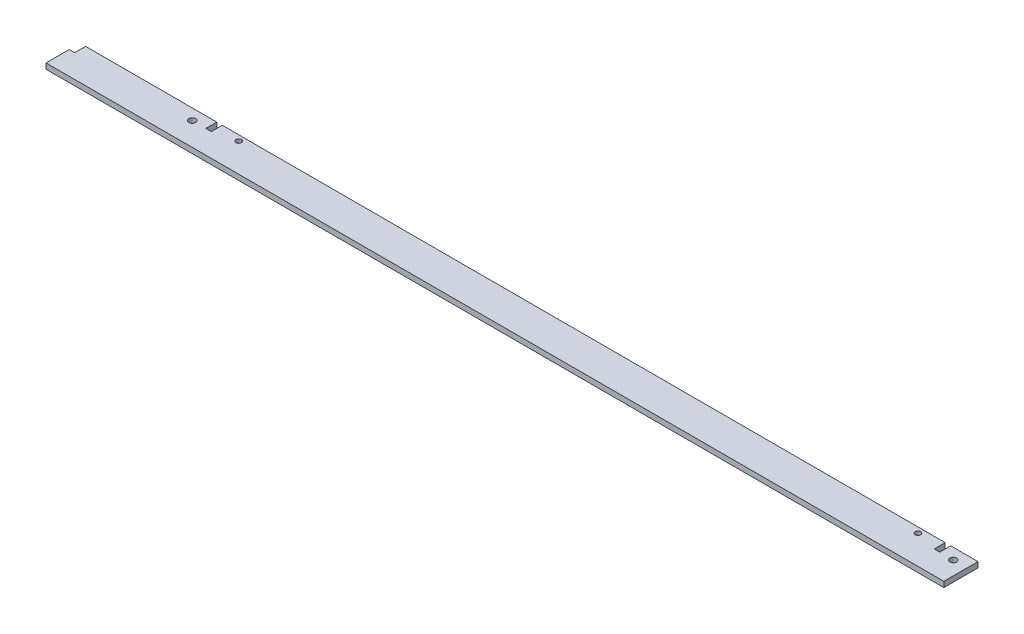
ISO-10303-21;
HEADER;
FILE_DESCRIPTION(('STEP AP214'),'2;1');
FILE_NAME('part.step','',(''),(''),'','','');
FILE_SCHEMA(('AUTOMOTIVE_DESIGN { 1 0 10303 214 1 1 1 1 }'));
ENDSEC;
DATA;
#1=APPLICATION_CONTEXT('core data for automotive mechanical design processes');
#2=APPLICATION_PROTOCOL_DEFINITION('international standard','automotive_design',2000,#1);
#3=PRODUCT_CONTEXT('',#1,'mechanical');
#4=PRODUCT('Part','Part','',(#3));
#5=PRODUCT_RELATED_PRODUCT_CATEGORY('part','',(#4));
#6=PRODUCT_DEFINITION_FORMATION('','',#4);
#7=PRODUCT_DEFINITION_CONTEXT('part definition',#1,'design');
#8=PRODUCT_DEFINITION('design','',#6,#7);
#9=PRODUCT_DEFINITION_SHAPE('','',#8);
#10=(LENGTH_UNIT() NAMED_UNIT(*) SI_UNIT(.MILLI.,.METRE.));
#11=(NAMED_UNIT(*) PLANE_ANGLE_UNIT() SI_UNIT($,.RADIAN.));
#12=(NAMED_UNIT(*) SI_UNIT($,.STERADIAN.) SOLID_ANGLE_UNIT());
#13=UNCERTAINTY_MEASURE_WITH_UNIT(LENGTH_MEASURE(1.E-05),#10,'distance_accuracy_value','');
#14=(GEOMETRIC_REPRESENTATION_CONTEXT(3) GLOBAL_UNCERTAINTY_ASSIGNED_CONTEXT((#13)) GLOBAL_UNIT_ASSIGNED_CONTEXT((#10,
#11,#12)) REPRESENTATION_CONTEXT('',''));
#15=CARTESIAN_POINT('',(0.,0.,0.));
#16=DIRECTION('',(0.,0.,1.));
#17=DIRECTION('',(1.,0.,0.));
#18=AXIS2_PLACEMENT_3D('',#15,#16,#17);
#19=CARTESIAN_POINT('',(0.,4.,0.));
#20=DIRECTION('',(0.,1.,0.));
#21=DIRECTION('',(0.,0.,1.));
#22=AXIS2_PLACEMENT_3D('',#19,#20,#21);
#23=PLANE('',#22);
#24=DIRECTION('',(0.,0.,-1.));
#25=VECTOR('',#24,1.);
#26=CARTESIAN_POINT('',(-358.43869808775,4.,81.1050281715099));
#27=LINE('',#26,#25);
#28=CARTESIAN_POINT('',(-358.43869808775,4.,89.1050281715099));
#29=VERTEX_POINT('',#28);
#30=CARTESIAN_POINT('',(-358.43869808775,4.,81.1050281715099));
#31=VERTEX_POINT('',#30);
#32=EDGE_CURVE('E54',#29,#31,#27,.T.);
#33=ORIENTED_EDGE('',*,*,#32,.F.);
#34=DIRECTION('',(1.,0.,0.));
#35=VECTOR('',#34,1.);
#36=CARTESIAN_POINT('',(-362.43869808775,4.,89.1050281715099));
#37=LINE('',#36,#35);
#38=CARTESIAN_POINT('',(-362.43869808775,4.,89.1050281715099));
#39=VERTEX_POINT('',#38);
#40=EDGE_CURVE('E294',#39,#29,#37,.T.);
#41=ORIENTED_EDGE('',*,*,#40,.F.);
#42=DIRECTION('',(0.,0.,1.));
#43=VECTOR('',#42,1.);
#44=CARTESIAN_POINT('',(-362.43869808775,4.,81.1050281715099));
#45=LINE('',#44,#43);
#46=CARTESIAN_POINT('',(-362.43869808775,4.,106.10502817151));
#47=VERTEX_POINT('',#46);
#48=EDGE_CURVE('E113',#39,#47,#45,.T.);
#49=ORIENTED_EDGE('',*,*,#48,.T.);
#50=DIRECTION('',(1.,0.,0.));
#51=VECTOR('',#50,1.);
#52=CARTESIAN_POINT('',(-362.43869808775,4.,106.10502817151));
#53=LINE('',#52,#51);
#54=CARTESIAN_POINT('',(294.56130191225,4.,106.10502817151));
#55=VERTEX_POINT('',#54);
#56=EDGE_CURVE('E348',#47,#55,#53,.T.);
#57=ORIENTED_EDGE('',*,*,#56,.T.);
#58=DIRECTION('',(0.,0.,-1.));
#59=VECTOR('',#58,1.);
#60=CARTESIAN_POINT('',(294.56130191225,4.,81.1050281715099));
#61=LINE('',#60,#59);
#62=CARTESIAN_POINT('',(294.56130191225,4.,81.1050281715099));
#63=VERTEX_POINT('',#62);
#64=EDGE_CURVE('E243',#55,#63,#61,.T.);
#65=ORIENTED_EDGE('',*,*,#64,.T.);
#66=DIRECTION('',(-1.,0.,0.));
#67=VECTOR('',#66,1.);
#68=CARTESIAN_POINT('',(274.56130191225,4.,81.1050281715099));
#69=LINE('',#68,#67);
#70=CARTESIAN_POINT('',(274.56130191225,4.,81.1050281715099));
#71=VERTEX_POINT('',#70);
#72=EDGE_CURVE('E266',#63,#71,#69,.T.);
#73=ORIENTED_EDGE('',*,*,#72,.T.);
#74=DIRECTION('',(0.,0.,1.));
#75=VECTOR('',#74,1.);
#76=CARTESIAN_POINT('',(274.56130191225,4.,89.1050281715099));
#77=LINE('',#76,#75);
#78=CARTESIAN_POINT('',(274.56130191225,4.,89.1050281715099));
#79=VERTEX_POINT('',#78);
#80=EDGE_CURVE('E262',#71,#79,#77,.T.);
#81=ORIENTED_EDGE('',*,*,#80,.T.);
#82=DIRECTION('',(-1.,0.,0.));
#83=VECTOR('',#82,1.);
#84=CARTESIAN_POINT('',(270.56130191225,4.,89.1050281715099));
#85=LINE('',#84,#83);
#86=CARTESIAN_POINT('',(270.56130191225,4.,89.1050281715099));
#87=VERTEX_POINT('',#86);
#88=EDGE_CURVE('E265',#79,#87,#85,.T.);
#89=ORIENTED_EDGE('',*,*,#88,.T.);
#90=DIRECTION('',(0.,0.,-1.));
#91=VECTOR('',#90,1.);
#92=CARTESIAN_POINT('',(270.56130191225,4.,81.1050281715099));
#93=LINE('',#92,#91);
#94=CARTESIAN_POINT('',(270.56130191225,4.,81.1050281715099));
#95=VERTEX_POINT('',#94);
#96=EDGE_CURVE('E270',#87,#95,#93,.T.);
#97=ORIENTED_EDGE('',*,*,#96,.T.);
#98=DIRECTION('',(-1.,0.,0.));
#99=VECTOR('',#98,1.);
#100=CARTESIAN_POINT('',(-258.43869808775,4.,81.1050281715099));
#101=LINE('',#100,#99);
#102=CARTESIAN_POINT('',(-258.43869808775,4.,81.1050281715099));
#103=VERTEX_POINT('',#102);
#104=EDGE_CURVE('E146',#95,#103,#101,.T.);
#105=ORIENTED_EDGE('',*,*,#104,.T.);
#106=DIRECTION('',(0.,0.,1.));
#107=VECTOR('',#106,1.);
#108=CARTESIAN_POINT('',(-258.43869808775,4.,89.1050281715099));
#109=LINE('',#108,#107);
#110=CARTESIAN_POINT('',(-258.43869808775,4.,89.1050281715099));
#111=VERTEX_POINT('',#110);
#112=EDGE_CURVE('E139',#103,#111,#109,.T.);
#113=ORIENTED_EDGE('',*,*,#112,.T.);
#114=DIRECTION('',(-1.,0.,0.));
#115=VECTOR('',#114,1.);
#116=CARTESIAN_POINT('',(-262.43869808775,4.,89.1050281715099));
#117=LINE('',#116,#115);
#118=CARTESIAN_POINT('',(-262.43869808775,4.,89.1050281715099));
#119=VERTEX_POINT('',#118);
#120=EDGE_CURVE('E143',#111,#119,#117,.T.);
#121=ORIENTED_EDGE('',*,*,#120,.T.);
#122=DIRECTION('',(0.,0.,-1.));
#123=VECTOR('',#122,1.);
#124=CARTESIAN_POINT('',(-262.43869808775,4.,81.1050281715099));
#125=LINE('',#124,#123);
#126=CARTESIAN_POINT('',(-262.43869808775,4.,81.1050281715099));
#127=VERTEX_POINT('',#126);
#128=EDGE_CURVE('E63',#119,#127,#125,.T.);
#129=ORIENTED_EDGE('',*,*,#128,.T.);
#130=DIRECTION('',(-1.,0.,0.));
#131=VECTOR('',#130,1.);
#132=CARTESIAN_POINT('',(-362.43869808775,4.,81.1050281715099));
#133=LINE('',#132,#131);
#134=EDGE_CURVE('E167',#127,#31,#133,.T.);
#135=ORIENTED_EDGE('',*,*,#134,.T.);
#136=EDGE_LOOP('',(#33,#41,#49,#57,#65,#73,#81,#89,#97,#105,#113,#121,#129,#135));
#137=FACE_BOUND('',#136,.T.);
#138=CARTESIAN_POINT('',(254.56130191225,4.,85.1050281715099));
#139=DIRECTION('',(0.,1.,0.));
#140=DIRECTION('',(0.,0.,1.));
#141=AXIS2_PLACEMENT_3D('',#138,#139,#140);
#142=CIRCLE('',#141,2.);
#143=CARTESIAN_POINT('',(254.56130191225,4.,87.1050281715099));
#144=VERTEX_POINT('',#143);
#145=EDGE_CURVE('E324',#144,#144,#142,.T.);
#146=ORIENTED_EDGE('',*,*,#145,.F.);
#147=EDGE_LOOP('',(#146));
#148=FACE_BOUND('',#147,.T.);
#149=CARTESIAN_POINT('',(284.56130191225,4.,89.1050281715099));
#150=DIRECTION('',(0.,1.,0.));
#151=DIRECTION('',(0.,0.,1.));
#152=AXIS2_PLACEMENT_3D('',#149,#150,#151);
#153=CIRCLE('',#152,2.50000000000002);
#154=CARTESIAN_POINT('',(284.56130191225,4.,91.6050281715099));
#155=VERTEX_POINT('',#154);
#156=EDGE_CURVE('E178',#155,#155,#153,.T.);
#157=ORIENTED_EDGE('',*,*,#156,.F.);
#158=EDGE_LOOP('',(#157));
#159=FACE_BOUND('',#158,.T.);
#160=CARTESIAN_POINT('',(-272.43869808775,4.,89.1050281715099));
#161=DIRECTION('',(0.,1.,0.));
#162=DIRECTION('',(0.,0.,1.));
#163=AXIS2_PLACEMENT_3D('',#160,#161,#162);
#164=CIRCLE('',#163,2.50000000000002);
#165=CARTESIAN_POINT('',(-272.43869808775,4.,91.6050281715099));
#166=VERTEX_POINT('',#165);
#167=EDGE_CURVE('E332',#166,#166,#164,.T.);
#168=ORIENTED_EDGE('',*,*,#167,.F.);
#169=EDGE_LOOP('',(#168));
#170=FACE_BOUND('',#169,.T.);
#171=CARTESIAN_POINT('',(-242.43869808775,4.,85.1050281715099));
#172=DIRECTION('',(0.,1.,0.));
#173=DIRECTION('',(0.,0.,1.));
#174=AXIS2_PLACEMENT_3D('',#171,#172,#173);
#175=CIRCLE('',#174,2.);
#176=CARTESIAN_POINT('',(-242.43869808775,4.,87.1050281715099));
#177=VERTEX_POINT('',#176);
#178=EDGE_CURVE('E316',#177,#177,#175,.T.);
#179=ORIENTED_EDGE('',*,*,#178,.F.);
#180=EDGE_LOOP('',(#179));
#181=FACE_BOUND('',#180,.T.);
#182=ADVANCED_FACE('F38',(#137,#148,#159,#170,#181),#23,.T.);
#183=CARTESIAN_POINT('',(0.,0.,0.));
#184=DIRECTION('',(0.,1.,0.));
#185=DIRECTION('',(0.,0.,1.));
#186=AXIS2_PLACEMENT_3D('',#183,#184,#185);
#187=PLANE('',#186);
#188=DIRECTION('',(1.,0.,0.));
#189=VECTOR('',#188,1.);
#190=CARTESIAN_POINT('',(-362.43869808775,0.,89.1050281715099));
#191=LINE('',#190,#189);
#192=CARTESIAN_POINT('',(-362.43869808775,0.,89.1050281715099));
#193=VERTEX_POINT('',#192);
#194=CARTESIAN_POINT('',(-358.43869808775,0.,89.1050281715099));
#195=VERTEX_POINT('',#194);
#196=EDGE_CURVE('E297',#193,#195,#191,.T.);
#197=ORIENTED_EDGE('',*,*,#196,.T.);
#198=DIRECTION('',(0.,0.,-1.));
#199=VECTOR('',#198,1.);
#200=CARTESIAN_POINT('',(-358.43869808775,0.,81.1050281715099));
#201=LINE('',#200,#199);
#202=CARTESIAN_POINT('',(-358.43869808775,0.,81.1050281715099));
#203=VERTEX_POINT('',#202);
#204=EDGE_CURVE('E301',#195,#203,#201,.T.);
#205=ORIENTED_EDGE('',*,*,#204,.T.);
#206=DIRECTION('',(-1.,0.,0.));
#207=VECTOR('',#206,1.);
#208=CARTESIAN_POINT('',(-362.43869808775,0.,81.1050281715099));
#209=LINE('',#208,#207);
#210=CARTESIAN_POINT('',(-262.43869808775,0.,81.1050281715099));
#211=VERTEX_POINT('',#210);
#212=EDGE_CURVE('E206',#211,#203,#209,.T.);
#213=ORIENTED_EDGE('',*,*,#212,.F.);
#214=DIRECTION('',(0.,0.,-1.));
#215=VECTOR('',#214,1.);
#216=CARTESIAN_POINT('',(-262.43869808775,0.,81.1050281715099));
#217=LINE('',#216,#215);
#218=CARTESIAN_POINT('',(-262.43869808775,0.,89.1050281715099));
#219=VERTEX_POINT('',#218);
#220=EDGE_CURVE('E105',#219,#211,#217,.T.);
#221=ORIENTED_EDGE('',*,*,#220,.F.);
#222=DIRECTION('',(-1.,0.,0.));
#223=VECTOR('',#222,1.);
#224=CARTESIAN_POINT('',(-262.43869808775,0.,89.1050281715099));
#225=LINE('',#224,#223);
#226=CARTESIAN_POINT('',(-258.43869808775,0.,89.1050281715099));
#227=VERTEX_POINT('',#226);
#228=EDGE_CURVE('E201',#227,#219,#225,.T.);
#229=ORIENTED_EDGE('',*,*,#228,.F.);
#230=DIRECTION('',(0.,0.,1.));
#231=VECTOR('',#230,1.);
#232=CARTESIAN_POINT('',(-258.43869808775,0.,89.1050281715099));
#233=LINE('',#232,#231);
#234=CARTESIAN_POINT('',(-258.43869808775,0.,81.1050281715099));
#235=VERTEX_POINT('',#234);
#236=EDGE_CURVE('E156',#235,#227,#233,.T.);
#237=ORIENTED_EDGE('',*,*,#236,.F.);
#238=DIRECTION('',(-1.,0.,0.));
#239=VECTOR('',#238,1.);
#240=CARTESIAN_POINT('',(-258.43869808775,0.,81.1050281715099));
#241=LINE('',#240,#239);
#242=CARTESIAN_POINT('',(270.56130191225,0.,81.1050281715099));
#243=VERTEX_POINT('',#242);
#244=EDGE_CURVE('E196',#243,#235,#241,.T.);
#245=ORIENTED_EDGE('',*,*,#244,.F.);
#246=DIRECTION('',(0.,0.,-1.));
#247=VECTOR('',#246,1.);
#248=CARTESIAN_POINT('',(270.56130191225,0.,81.1050281715099));
#249=LINE('',#248,#247);
#250=CARTESIAN_POINT('',(270.56130191225,0.,89.1050281715099));
#251=VERTEX_POINT('',#250);
#252=EDGE_CURVE('E193',#251,#243,#249,.T.);
#253=ORIENTED_EDGE('',*,*,#252,.F.);
#254=DIRECTION('',(-1.,0.,0.));
#255=VECTOR('',#254,1.);
#256=CARTESIAN_POINT('',(270.56130191225,0.,89.1050281715099));
#257=LINE('',#256,#255);
#258=CARTESIAN_POINT('',(274.56130191225,0.,89.1050281715099));
#259=VERTEX_POINT('',#258);
#260=EDGE_CURVE('E190',#259,#251,#257,.T.);
#261=ORIENTED_EDGE('',*,*,#260,.F.);
#262=DIRECTION('',(0.,0.,1.));
#263=VECTOR('',#262,1.);
#264=CARTESIAN_POINT('',(274.56130191225,0.,89.1050281715099));
#265=LINE('',#264,#263);
#266=CARTESIAN_POINT('',(274.56130191225,0.,81.1050281715099));
#267=VERTEX_POINT('',#266);
#268=EDGE_CURVE('E187',#267,#259,#265,.T.);
#269=ORIENTED_EDGE('',*,*,#268,.F.);
#270=DIRECTION('',(-1.,0.,0.));
#271=VECTOR('',#270,1.);
#272=CARTESIAN_POINT('',(274.56130191225,0.,81.1050281715099));
#273=LINE('',#272,#271);
#274=CARTESIAN_POINT('',(294.56130191225,0.,81.1050281715099));
#275=VERTEX_POINT('',#274);
#276=EDGE_CURVE('E184',#275,#267,#273,.T.);
#277=ORIENTED_EDGE('',*,*,#276,.F.);
#278=DIRECTION('',(0.,0.,-1.));
#279=VECTOR('',#278,1.);
#280=CARTESIAN_POINT('',(294.56130191225,0.,81.1050281715099));
#281=LINE('',#280,#279);
#282=CARTESIAN_POINT('',(294.56130191225,0.,106.10502817151));
#283=VERTEX_POINT('',#282);
#284=EDGE_CURVE('E181',#283,#275,#281,.T.);
#285=ORIENTED_EDGE('',*,*,#284,.F.);
#286=DIRECTION('',(1.,0.,0.));
#287=VECTOR('',#286,1.);
#288=CARTESIAN_POINT('',(-362.43869808775,0.,106.10502817151));
#289=LINE('',#288,#287);
#290=CARTESIAN_POINT('',(-362.43869808775,0.,106.10502817151));
#291=VERTEX_POINT('',#290);
#292=EDGE_CURVE('E177',#291,#283,#289,.T.);
#293=ORIENTED_EDGE('',*,*,#292,.F.);
#294=DIRECTION('',(0.,0.,1.));
#295=VECTOR('',#294,1.);
#296=CARTESIAN_POINT('',(-362.43869808775,0.,81.1050281715099));
#297=LINE('',#296,#295);
#298=EDGE_CURVE('E174',#193,#291,#297,.T.);
#299=ORIENTED_EDGE('',*,*,#298,.F.);
#300=EDGE_LOOP('',(#197,#205,#213,#221,#229,#237,#245,#253,#261,#269,#277,#285,#293,#299));
#301=FACE_BOUND('',#300,.T.);
#302=CARTESIAN_POINT('',(284.56130191225,0.,89.1050281715099));
#303=DIRECTION('',(0.,1.,0.));
#304=DIRECTION('',(0.,0.,1.));
#305=AXIS2_PLACEMENT_3D('',#302,#303,#304);
#306=CIRCLE('',#305,2.50000000000002);
#307=CARTESIAN_POINT('',(284.56130191225,0.,91.6050281715099));
#308=VERTEX_POINT('',#307);
#309=EDGE_CURVE('E336',#308,#308,#306,.T.);
#310=ORIENTED_EDGE('',*,*,#309,.T.);
#311=EDGE_LOOP('',(#310));
#312=FACE_BOUND('',#311,.T.);
#313=CARTESIAN_POINT('',(-272.43869808775,0.,89.1050281715099));
#314=DIRECTION('',(0.,1.,0.));
#315=DIRECTION('',(0.,0.,1.));
#316=AXIS2_PLACEMENT_3D('',#313,#314,#315);
#317=CIRCLE('',#316,2.50000000000002);
#318=CARTESIAN_POINT('',(-272.43869808775,0.,91.6050281715099));
#319=VERTEX_POINT('',#318);
#320=EDGE_CURVE('E328',#319,#319,#317,.T.);
#321=ORIENTED_EDGE('',*,*,#320,.T.);
#322=EDGE_LOOP('',(#321));
#323=FACE_BOUND('',#322,.T.);
#324=CARTESIAN_POINT('',(254.56130191225,0.,85.1050281715099));
#325=DIRECTION('',(0.,1.,0.));
#326=DIRECTION('',(0.,0.,1.));
#327=AXIS2_PLACEMENT_3D('',#324,#325,#326);
#328=CIRCLE('',#327,2.);
#329=CARTESIAN_POINT('',(254.56130191225,0.,87.1050281715099));
#330=VERTEX_POINT('',#329);
#331=EDGE_CURVE('E320',#330,#330,#328,.T.);
#332=ORIENTED_EDGE('',*,*,#331,.T.);
#333=EDGE_LOOP('',(#332));
#334=FACE_BOUND('',#333,.T.);
#335=CARTESIAN_POINT('',(-242.43869808775,0.,85.1050281715099));
#336=DIRECTION('',(0.,1.,0.));
#337=DIRECTION('',(0.,0.,1.));
#338=AXIS2_PLACEMENT_3D('',#335,#336,#337);
#339=CIRCLE('',#338,2.);
#340=CARTESIAN_POINT('',(-242.43869808775,0.,87.1050281715099));
#341=VERTEX_POINT('',#340);
#342=EDGE_CURVE('E308',#341,#341,#339,.T.);
#343=ORIENTED_EDGE('',*,*,#342,.T.);
#344=EDGE_LOOP('',(#343));
#345=FACE_BOUND('',#344,.T.);
#346=ADVANCED_FACE('F249',(#301,#312,#323,#334,#345),#187,.F.);
#347=CARTESIAN_POINT('',(-362.43869808775,4.,81.1050281715099));
#348=DIRECTION('',(1.,0.,0.));
#349=DIRECTION('',(0.,0.,-1.));
#350=AXIS2_PLACEMENT_3D('',#347,#348,#349);
#351=PLANE('',#350);
#352=ORIENTED_EDGE('',*,*,#48,.F.);
#353=DIRECTION('',(0.,1.,0.));
#354=VECTOR('',#353,1.);
#355=CARTESIAN_POINT('',(-362.43869808775,0.,89.1050281715099));
#356=LINE('',#355,#354);
#357=EDGE_CURVE('E312',#193,#39,#356,.T.);
#358=ORIENTED_EDGE('',*,*,#357,.F.);
#359=ORIENTED_EDGE('',*,*,#298,.T.);
#360=DIRECTION('',(0.,-1.,0.));
#361=VECTOR('',#360,1.);
#362=CARTESIAN_POINT('',(-362.43869808775,4.,106.10502817151));
#363=LINE('',#362,#361);
#364=EDGE_CURVE('E11',#47,#291,#363,.T.);
#365=ORIENTED_EDGE('',*,*,#364,.F.);
#366=EDGE_LOOP('',(#352,#358,#359,#365));
#367=FACE_BOUND('',#366,.T.);
#368=ADVANCED_FACE('F40',(#367),#351,.F.);
#369=CARTESIAN_POINT('',(-362.43869808775,4.,106.10502817151));
#370=DIRECTION('',(0.,0.,-1.));
#371=DIRECTION('',(-1.,0.,0.));
#372=AXIS2_PLACEMENT_3D('',#369,#370,#371);
#373=PLANE('',#372);
#374=ORIENTED_EDGE('',*,*,#292,.T.);
#375=DIRECTION('',(0.,-1.,0.));
#376=VECTOR('',#375,1.);
#377=CARTESIAN_POINT('',(294.56130191225,4.,106.10502817151));
#378=LINE('',#377,#376);
#379=EDGE_CURVE('E47',#55,#283,#378,.T.);
#380=ORIENTED_EDGE('',*,*,#379,.F.);
#381=ORIENTED_EDGE('',*,*,#56,.F.);
#382=ORIENTED_EDGE('',*,*,#364,.T.);
#383=EDGE_LOOP('',(#374,#380,#381,#382));
#384=FACE_BOUND('',#383,.T.);
#385=ADVANCED_FACE('F352',(#384),#373,.F.);
#386=CARTESIAN_POINT('',(294.56130191225,4.,81.1050281715099));
#387=DIRECTION('',(-1.,0.,0.));
#388=DIRECTION('',(0.,0.,1.));
#389=AXIS2_PLACEMENT_3D('',#386,#387,#388);
#390=PLANE('',#389);
#391=ORIENTED_EDGE('',*,*,#284,.T.);
#392=DIRECTION('',(0.,-1.,0.));
#393=VECTOR('',#392,1.);
#394=CARTESIAN_POINT('',(294.56130191225,4.,81.1050281715099));
#395=LINE('',#394,#393);
#396=EDGE_CURVE('E232',#63,#275,#395,.T.);
#397=ORIENTED_EDGE('',*,*,#396,.F.);
#398=ORIENTED_EDGE('',*,*,#64,.F.);
#399=ORIENTED_EDGE('',*,*,#379,.T.);
#400=EDGE_LOOP('',(#391,#397,#398,#399));
#401=FACE_BOUND('',#400,.T.);
#402=ADVANCED_FACE('F241',(#401),#390,.F.);
#403=CARTESIAN_POINT('',(274.56130191225,4.,81.1050281715099));
#404=DIRECTION('',(0.,0.,1.));
#405=DIRECTION('',(1.,0.,0.));
#406=AXIS2_PLACEMENT_3D('',#403,#404,#405);
#407=PLANE('',#406);
#408=ORIENTED_EDGE('',*,*,#276,.T.);
#409=DIRECTION('',(0.,-1.,0.));
#410=VECTOR('',#409,1.);
#411=CARTESIAN_POINT('',(274.56130191225,4.,81.1050281715099));
#412=LINE('',#411,#410);
#413=EDGE_CURVE('E228',#71,#267,#412,.T.);
#414=ORIENTED_EDGE('',*,*,#413,.F.);
#415=ORIENTED_EDGE('',*,*,#72,.F.);
#416=ORIENTED_EDGE('',*,*,#396,.T.);
#417=EDGE_LOOP('',(#408,#414,#415,#416));
#418=FACE_BOUND('',#417,.T.);
#419=ADVANCED_FACE('F256',(#418),#407,.F.);
#420=CARTESIAN_POINT('',(274.56130191225,4.,89.1050281715099));
#421=DIRECTION('',(1.,0.,0.));
#422=DIRECTION('',(0.,0.,-1.));
#423=AXIS2_PLACEMENT_3D('',#420,#421,#422);
#424=PLANE('',#423);
#425=ORIENTED_EDGE('',*,*,#268,.T.);
#426=DIRECTION('',(0.,-1.,0.));
#427=VECTOR('',#426,1.);
#428=CARTESIAN_POINT('',(274.56130191225,4.,89.1050281715099));
#429=LINE('',#428,#427);
#430=EDGE_CURVE('E224',#79,#259,#429,.T.);
#431=ORIENTED_EDGE('',*,*,#430,.F.);
#432=ORIENTED_EDGE('',*,*,#80,.F.);
#433=ORIENTED_EDGE('',*,*,#413,.T.);
#434=EDGE_LOOP('',(#425,#431,#432,#433));
#435=FACE_BOUND('',#434,.T.);
#436=ADVANCED_FACE('F260',(#435),#424,.F.);
#437=CARTESIAN_POINT('',(270.56130191225,4.,89.1050281715099));
#438=DIRECTION('',(0.,0.,1.));
#439=DIRECTION('',(1.,0.,0.));
#440=AXIS2_PLACEMENT_3D('',#437,#438,#439);
#441=PLANE('',#440);
#442=ORIENTED_EDGE('',*,*,#260,.T.);
#443=DIRECTION('',(0.,-1.,0.));
#444=VECTOR('',#443,1.);
#445=CARTESIAN_POINT('',(270.56130191225,4.,89.1050281715099));
#446=LINE('',#445,#444);
#447=EDGE_CURVE('E220',#87,#251,#446,.T.);
#448=ORIENTED_EDGE('',*,*,#447,.F.);
#449=ORIENTED_EDGE('',*,*,#88,.F.);
#450=ORIENTED_EDGE('',*,*,#430,.T.);
#451=EDGE_LOOP('',(#442,#448,#449,#450));
#452=FACE_BOUND('',#451,.T.);
#453=ADVANCED_FACE('F400',(#452),#441,.F.);
#454=CARTESIAN_POINT('',(270.56130191225,4.,81.1050281715099));
#455=DIRECTION('',(-1.,0.,0.));
#456=DIRECTION('',(0.,0.,1.));
#457=AXIS2_PLACEMENT_3D('',#454,#455,#456);
#458=PLANE('',#457);
#459=ORIENTED_EDGE('',*,*,#252,.T.);
#460=DIRECTION('',(0.,-1.,0.));
#461=VECTOR('',#460,1.);
#462=CARTESIAN_POINT('',(270.56130191225,4.,81.1050281715099));
#463=LINE('',#462,#461);
#464=EDGE_CURVE('E216',#95,#243,#463,.T.);
#465=ORIENTED_EDGE('',*,*,#464,.F.);
#466=ORIENTED_EDGE('',*,*,#96,.F.);
#467=ORIENTED_EDGE('',*,*,#447,.T.);
#468=EDGE_LOOP('',(#459,#465,#466,#467));
#469=FACE_BOUND('',#468,.T.);
#470=ADVANCED_FACE('F281',(#469),#458,.F.);
#471=CARTESIAN_POINT('',(-258.43869808775,4.,81.1050281715099));
#472=DIRECTION('',(0.,0.,1.));
#473=DIRECTION('',(1.,0.,0.));
#474=AXIS2_PLACEMENT_3D('',#471,#472,#473);
#475=PLANE('',#474);
#476=ORIENTED_EDGE('',*,*,#244,.T.);
#477=DIRECTION('',(0.,-1.,0.));
#478=VECTOR('',#477,1.);
#479=CARTESIAN_POINT('',(-258.43869808775,4.,81.1050281715099));
#480=LINE('',#479,#478);
#481=EDGE_CURVE('E160',#103,#235,#480,.T.);
#482=ORIENTED_EDGE('',*,*,#481,.F.);
#483=ORIENTED_EDGE('',*,*,#104,.F.);
#484=ORIENTED_EDGE('',*,*,#464,.T.);
#485=EDGE_LOOP('',(#476,#482,#483,#484));
#486=FACE_BOUND('',#485,.T.);
#487=ADVANCED_FACE('F285',(#486),#475,.F.);
#488=CARTESIAN_POINT('',(-258.43869808775,4.,89.1050281715099));
#489=DIRECTION('',(1.,0.,0.));
#490=DIRECTION('',(0.,0.,-1.));
#491=AXIS2_PLACEMENT_3D('',#488,#489,#490);
#492=PLANE('',#491);
#493=ORIENTED_EDGE('',*,*,#236,.T.);
#494=DIRECTION('',(0.,-1.,0.));
#495=VECTOR('',#494,1.);
#496=CARTESIAN_POINT('',(-258.43869808775,4.,89.1050281715099));
#497=LINE('',#496,#495);
#498=EDGE_CURVE('E153',#111,#227,#497,.T.);
#499=ORIENTED_EDGE('',*,*,#498,.F.);
#500=ORIENTED_EDGE('',*,*,#112,.F.);
#501=ORIENTED_EDGE('',*,*,#481,.T.);
#502=EDGE_LOOP('',(#493,#499,#500,#501));
#503=FACE_BOUND('',#502,.T.);
#504=ADVANCED_FACE('F154',(#503),#492,.F.);
#505=CARTESIAN_POINT('',(-262.43869808775,4.,89.1050281715099));
#506=DIRECTION('',(0.,0.,1.));
#507=DIRECTION('',(1.,0.,0.));
#508=AXIS2_PLACEMENT_3D('',#505,#506,#507);
#509=PLANE('',#508);
#510=ORIENTED_EDGE('',*,*,#228,.T.);
#511=DIRECTION('',(0.,-1.,0.));
#512=VECTOR('',#511,1.);
#513=CARTESIAN_POINT('',(-262.43869808775,4.,89.1050281715099));
#514=LINE('',#513,#512);
#515=EDGE_CURVE('E161',#119,#219,#514,.T.);
#516=ORIENTED_EDGE('',*,*,#515,.F.);
#517=ORIENTED_EDGE('',*,*,#120,.F.);
#518=ORIENTED_EDGE('',*,*,#498,.T.);
#519=EDGE_LOOP('',(#510,#516,#517,#518));
#520=FACE_BOUND('',#519,.T.);
#521=ADVANCED_FACE('F163',(#520),#509,.F.);
#522=CARTESIAN_POINT('',(-262.43869808775,4.,81.1050281715099));
#523=DIRECTION('',(-1.,0.,0.));
#524=DIRECTION('',(0.,0.,1.));
#525=AXIS2_PLACEMENT_3D('',#522,#523,#524);
#526=PLANE('',#525);
#527=ORIENTED_EDGE('',*,*,#220,.T.);
#528=DIRECTION('',(0.,-1.,0.));
#529=VECTOR('',#528,1.);
#530=CARTESIAN_POINT('',(-262.43869808775,4.,81.1050281715099));
#531=LINE('',#530,#529);
#532=EDGE_CURVE('E173',#127,#211,#531,.T.);
#533=ORIENTED_EDGE('',*,*,#532,.F.);
#534=ORIENTED_EDGE('',*,*,#128,.F.);
#535=ORIENTED_EDGE('',*,*,#515,.T.);
#536=EDGE_LOOP('',(#527,#533,#534,#535));
#537=FACE_BOUND('',#536,.T.);
#538=ADVANCED_FACE('F287',(#537),#526,.F.);
#539=CARTESIAN_POINT('',(-362.43869808775,4.,81.1050281715099));
#540=DIRECTION('',(0.,0.,1.));
#541=DIRECTION('',(1.,0.,0.));
#542=AXIS2_PLACEMENT_3D('',#539,#540,#541);
#543=PLANE('',#542);
#544=ORIENTED_EDGE('',*,*,#212,.T.);
#545=DIRECTION('',(0.,1.,0.));
#546=VECTOR('',#545,1.);
#547=CARTESIAN_POINT('',(-358.43869808775,0.,81.1050281715099));
#548=LINE('',#547,#546);
#549=EDGE_CURVE('E291',#203,#31,#548,.T.);
#550=ORIENTED_EDGE('',*,*,#549,.T.);
#551=ORIENTED_EDGE('',*,*,#134,.F.);
#552=ORIENTED_EDGE('',*,*,#532,.T.);
#553=EDGE_LOOP('',(#544,#550,#551,#552));
#554=FACE_BOUND('',#553,.T.);
#555=ADVANCED_FACE('F290',(#554),#543,.F.);
#556=CARTESIAN_POINT('',(284.56130191225,4.,89.1050281715099));
#557=DIRECTION('',(0.,-1.,0.));
#558=DIRECTION('',(0.,0.,-1.));
#559=AXIS2_PLACEMENT_3D('',#556,#557,#558);
#560=CYLINDRICAL_SURFACE('',#559,2.50000000000002);
#561=ORIENTED_EDGE('',*,*,#156,.T.);
#562=EDGE_LOOP('',(#561));
#563=FACE_BOUND('',#562,.T.);
#564=ORIENTED_EDGE('',*,*,#309,.F.);
#565=EDGE_LOOP('',(#564));
#566=FACE_BOUND('',#565,.T.);
#567=ADVANCED_FACE('F385',(#563,#566),#560,.F.);
#568=CARTESIAN_POINT('',(-272.43869808775,4.,89.1050281715099));
#569=DIRECTION('',(0.,-1.,0.));
#570=DIRECTION('',(0.,0.,-1.));
#571=AXIS2_PLACEMENT_3D('',#568,#569,#570);
#572=CYLINDRICAL_SURFACE('',#571,2.50000000000002);
#573=ORIENTED_EDGE('',*,*,#167,.T.);
#574=EDGE_LOOP('',(#573));
#575=FACE_BOUND('',#574,.T.);
#576=ORIENTED_EDGE('',*,*,#320,.F.);
#577=EDGE_LOOP('',(#576));
#578=FACE_BOUND('',#577,.T.);
#579=ADVANCED_FACE('F440',(#575,#578),#572,.F.);
#580=CARTESIAN_POINT('',(254.56130191225,4.,85.1050281715099));
#581=DIRECTION('',(0.,-1.,0.));
#582=DIRECTION('',(0.,0.,-1.));
#583=AXIS2_PLACEMENT_3D('',#580,#581,#582);
#584=CYLINDRICAL_SURFACE('',#583,2.);
#585=ORIENTED_EDGE('',*,*,#145,.T.);
#586=EDGE_LOOP('',(#585));
#587=FACE_BOUND('',#586,.T.);
#588=ORIENTED_EDGE('',*,*,#331,.F.);
#589=EDGE_LOOP('',(#588));
#590=FACE_BOUND('',#589,.T.);
#591=ADVANCED_FACE('F375',(#587,#590),#584,.F.);
#592=CARTESIAN_POINT('',(-242.43869808775,4.,85.1050281715099));
#593=DIRECTION('',(0.,-1.,0.));
#594=DIRECTION('',(0.,0.,-1.));
#595=AXIS2_PLACEMENT_3D('',#592,#593,#594);
#596=CYLINDRICAL_SURFACE('',#595,2.);
#597=ORIENTED_EDGE('',*,*,#178,.T.);
#598=EDGE_LOOP('',(#597));
#599=FACE_BOUND('',#598,.T.);
#600=ORIENTED_EDGE('',*,*,#342,.F.);
#601=EDGE_LOOP('',(#600));
#602=FACE_BOUND('',#601,.T.);
#603=ADVANCED_FACE('F368',(#599,#602),#596,.F.);
#604=CARTESIAN_POINT('',(-358.43869808775,0.,81.1050281715099));
#605=DIRECTION('',(1.,0.,0.));
#606=DIRECTION('',(0.,0.,-1.));
#607=AXIS2_PLACEMENT_3D('',#604,#605,#606);
#608=PLANE('',#607);
#609=ORIENTED_EDGE('',*,*,#32,.T.);
#610=ORIENTED_EDGE('',*,*,#549,.F.);
#611=ORIENTED_EDGE('',*,*,#204,.F.);
#612=DIRECTION('',(0.,1.,0.));
#613=VECTOR('',#612,1.);
#614=CARTESIAN_POINT('',(-358.43869808775,0.,89.1050281715099));
#615=LINE('',#614,#613);
#616=EDGE_CURVE('E309',#195,#29,#615,.T.);
#617=ORIENTED_EDGE('',*,*,#616,.T.);
#618=EDGE_LOOP('',(#609,#610,#611,#617));
#619=FACE_BOUND('',#618,.T.);
#620=ADVANCED_FACE('F365',(#619),#608,.F.);
#621=CARTESIAN_POINT('',(-362.43869808775,0.,89.1050281715099));
#622=DIRECTION('',(0.,0.,1.));
#623=DIRECTION('',(1.,0.,0.));
#624=AXIS2_PLACEMENT_3D('',#621,#622,#623);
#625=PLANE('',#624);
#626=ORIENTED_EDGE('',*,*,#40,.T.);
#627=ORIENTED_EDGE('',*,*,#616,.F.);
#628=ORIENTED_EDGE('',*,*,#196,.F.);
#629=ORIENTED_EDGE('',*,*,#357,.T.);
#630=EDGE_LOOP('',(#626,#627,#628,#629));
#631=FACE_BOUND('',#630,.T.);
#632=ADVANCED_FACE('F363',(#631),#625,.F.);
#633=CLOSED_SHELL('',(#182,#346,#368,#385,#402,#419,#436,#453,#470,#487,#504,#521,#538,#555,
#567,#579,#591,#603,#620,#632));
#634=MANIFOLD_SOLID_BREP('B2',#633);
#635=ADVANCED_BREP_SHAPE_REPRESENTATION('',(#18,#634),#14);
#636=SHAPE_DEFINITION_REPRESENTATION(#9,#635);
ENDSEC;
END-ISO-10303-21;
